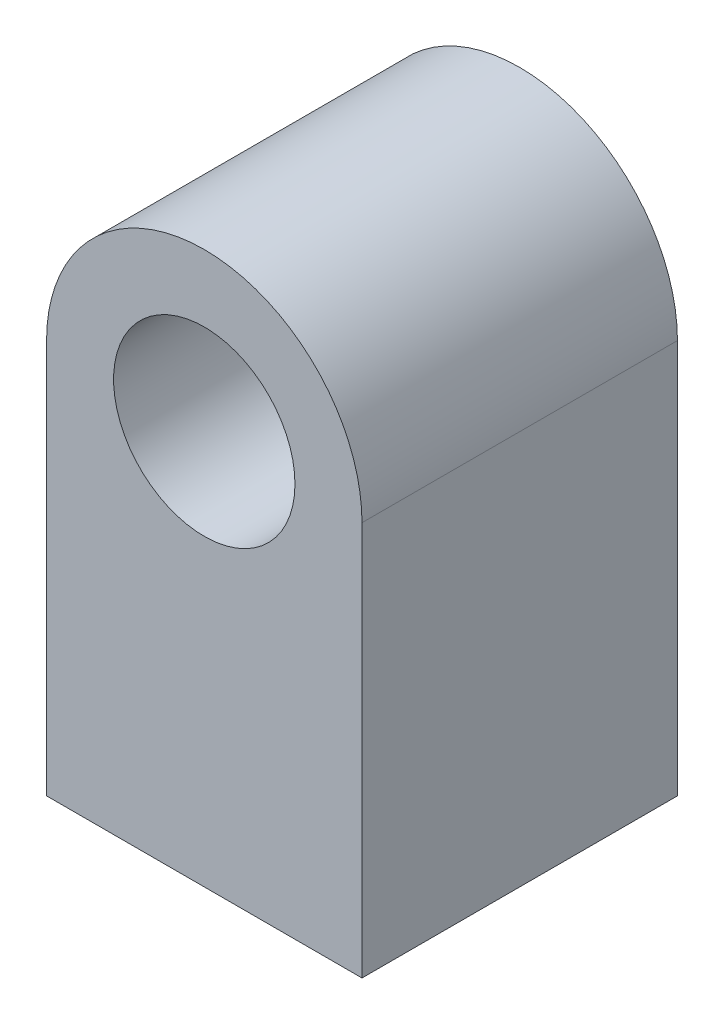
ISO-10303-21;
HEADER;
FILE_DESCRIPTION(('STEP AP214'),'2;1');
FILE_NAME('part.step','',(''),(''),'','','');
FILE_SCHEMA(('AUTOMOTIVE_DESIGN { 1 0 10303 214 1 1 1 1 }'));
ENDSEC;
DATA;
#1=APPLICATION_CONTEXT('core data for automotive mechanical design processes');
#2=APPLICATION_PROTOCOL_DEFINITION('international standard','automotive_design',2000,#1);
#3=PRODUCT_CONTEXT('',#1,'mechanical');
#4=PRODUCT('Part','Part','',(#3));
#5=PRODUCT_RELATED_PRODUCT_CATEGORY('part','',(#4));
#6=PRODUCT_DEFINITION_FORMATION('','',#4);
#7=PRODUCT_DEFINITION_CONTEXT('part definition',#1,'design');
#8=PRODUCT_DEFINITION('design','',#6,#7);
#9=PRODUCT_DEFINITION_SHAPE('','',#8);
#10=(LENGTH_UNIT() NAMED_UNIT(*) SI_UNIT(.MILLI.,.METRE.));
#11=(NAMED_UNIT(*) PLANE_ANGLE_UNIT() SI_UNIT($,.RADIAN.));
#12=(NAMED_UNIT(*) SI_UNIT($,.STERADIAN.) SOLID_ANGLE_UNIT());
#13=UNCERTAINTY_MEASURE_WITH_UNIT(LENGTH_MEASURE(1.E-05),#10,'distance_accuracy_value','');
#14=(GEOMETRIC_REPRESENTATION_CONTEXT(3) GLOBAL_UNCERTAINTY_ASSIGNED_CONTEXT((#13)) GLOBAL_UNIT_ASSIGNED_CONTEXT((#10,
#11,#12)) REPRESENTATION_CONTEXT('',''));
#15=CARTESIAN_POINT('',(0.,0.,0.));
#16=DIRECTION('',(0.,0.,1.));
#17=DIRECTION('',(1.,0.,0.));
#18=AXIS2_PLACEMENT_3D('',#15,#16,#17);
#19=CARTESIAN_POINT('',(0.,0.,4.));
#20=DIRECTION('',(0.,0.,1.));
#21=DIRECTION('',(1.,0.,0.));
#22=AXIS2_PLACEMENT_3D('',#19,#20,#21);
#23=PLANE('',#22);
#24=CARTESIAN_POINT('',(0.,0.,4.));
#25=DIRECTION('',(0.,0.,1.));
#26=DIRECTION('',(1.,0.,0.));
#27=AXIS2_PLACEMENT_3D('',#24,#25,#26);
#28=CIRCLE('',#27,2.);
#29=CARTESIAN_POINT('',(2.,0.,4.));
#30=VERTEX_POINT('',#29);
#31=CARTESIAN_POINT('',(-2.,0.,4.));
#32=VERTEX_POINT('',#31);
#33=EDGE_CURVE('E93',#30,#32,#28,.T.);
#34=ORIENTED_EDGE('',*,*,#33,.T.);
#35=DIRECTION('',(0.,-1.,0.));
#36=VECTOR('',#35,1.);
#37=CARTESIAN_POINT('',(-2.,-5.,4.));
#38=LINE('',#37,#36);
#39=CARTESIAN_POINT('',(-2.,-5.,4.));
#40=VERTEX_POINT('',#39);
#41=EDGE_CURVE('E88',#32,#40,#38,.T.);
#42=ORIENTED_EDGE('',*,*,#41,.T.);
#43=DIRECTION('',(1.,0.,0.));
#44=VECTOR('',#43,1.);
#45=CARTESIAN_POINT('',(2.,-5.,4.));
#46=LINE('',#45,#44);
#47=CARTESIAN_POINT('',(2.,-5.,4.));
#48=VERTEX_POINT('',#47);
#49=EDGE_CURVE('E91',#40,#48,#46,.T.);
#50=ORIENTED_EDGE('',*,*,#49,.T.);
#51=DIRECTION('',(0.,1.,0.));
#52=VECTOR('',#51,1.);
#53=CARTESIAN_POINT('',(2.,0.,4.));
#54=LINE('',#53,#52);
#55=EDGE_CURVE('E58',#48,#30,#54,.T.);
#56=ORIENTED_EDGE('',*,*,#55,.T.);
#57=EDGE_LOOP('',(#34,#42,#50,#56));
#58=FACE_BOUND('',#57,.T.);
#59=CARTESIAN_POINT('',(0.,0.,4.));
#60=DIRECTION('',(0.,0.,1.));
#61=DIRECTION('',(1.,0.,0.));
#62=AXIS2_PLACEMENT_3D('',#59,#60,#61);
#63=CIRCLE('',#62,1.15);
#64=CARTESIAN_POINT('',(1.15,0.,4.));
#65=VERTEX_POINT('',#64);
#66=EDGE_CURVE('E108',#65,#65,#63,.T.);
#67=ORIENTED_EDGE('',*,*,#66,.F.);
#68=EDGE_LOOP('',(#67));
#69=FACE_BOUND('',#68,.T.);
#70=ADVANCED_FACE('F41',(#58,#69),#23,.T.);
#71=CARTESIAN_POINT('',(0.,0.,0.));
#72=DIRECTION('',(0.,0.,1.));
#73=DIRECTION('',(1.,0.,0.));
#74=AXIS2_PLACEMENT_3D('',#71,#72,#73);
#75=PLANE('',#74);
#76=CARTESIAN_POINT('',(0.,0.,0.));
#77=DIRECTION('',(0.,0.,1.));
#78=DIRECTION('',(1.,0.,0.));
#79=AXIS2_PLACEMENT_3D('',#76,#77,#78);
#80=CIRCLE('',#79,2.);
#81=CARTESIAN_POINT('',(2.,0.,0.));
#82=VERTEX_POINT('',#81);
#83=CARTESIAN_POINT('',(-2.,0.,0.));
#84=VERTEX_POINT('',#83);
#85=EDGE_CURVE('E105',#82,#84,#80,.T.);
#86=ORIENTED_EDGE('',*,*,#85,.F.);
#87=DIRECTION('',(0.,1.,0.));
#88=VECTOR('',#87,1.);
#89=CARTESIAN_POINT('',(2.,0.,0.));
#90=LINE('',#89,#88);
#91=CARTESIAN_POINT('',(2.,-5.,0.));
#92=VERTEX_POINT('',#91);
#93=EDGE_CURVE('E81',#92,#82,#90,.T.);
#94=ORIENTED_EDGE('',*,*,#93,.F.);
#95=DIRECTION('',(1.,0.,0.));
#96=VECTOR('',#95,1.);
#97=CARTESIAN_POINT('',(2.,-5.,0.));
#98=LINE('',#97,#96);
#99=CARTESIAN_POINT('',(-2.,-5.,0.));
#100=VERTEX_POINT('',#99);
#101=EDGE_CURVE('E75',#100,#92,#98,.T.);
#102=ORIENTED_EDGE('',*,*,#101,.F.);
#103=DIRECTION('',(0.,-1.,0.));
#104=VECTOR('',#103,1.);
#105=CARTESIAN_POINT('',(-2.,-5.,0.));
#106=LINE('',#105,#104);
#107=EDGE_CURVE('E97',#84,#100,#106,.T.);
#108=ORIENTED_EDGE('',*,*,#107,.F.);
#109=EDGE_LOOP('',(#86,#94,#102,#108));
#110=FACE_BOUND('',#109,.T.);
#111=CARTESIAN_POINT('',(0.,0.,0.));
#112=DIRECTION('',(0.,0.,1.));
#113=DIRECTION('',(1.,0.,0.));
#114=AXIS2_PLACEMENT_3D('',#111,#112,#113);
#115=CIRCLE('',#114,1.15);
#116=CARTESIAN_POINT('',(1.15,0.,0.));
#117=VERTEX_POINT('',#116);
#118=EDGE_CURVE('E120',#117,#117,#115,.T.);
#119=ORIENTED_EDGE('',*,*,#118,.T.);
#120=EDGE_LOOP('',(#119));
#121=FACE_BOUND('',#120,.T.);
#122=ADVANCED_FACE('F116',(#110,#121),#75,.F.);
#123=CARTESIAN_POINT('',(0.,0.,4.));
#124=DIRECTION('',(0.,0.,-1.));
#125=DIRECTION('',(-1.,0.,0.));
#126=AXIS2_PLACEMENT_3D('',#123,#124,#125);
#127=CYLINDRICAL_SURFACE('',#126,2.);
#128=ORIENTED_EDGE('',*,*,#85,.T.);
#129=DIRECTION('',(0.,0.,-1.));
#130=VECTOR('',#129,1.);
#131=CARTESIAN_POINT('',(-2.,0.,4.));
#132=LINE('',#131,#130);
#133=EDGE_CURVE('E11',#32,#84,#132,.T.);
#134=ORIENTED_EDGE('',*,*,#133,.F.);
#135=ORIENTED_EDGE('',*,*,#33,.F.);
#136=DIRECTION('',(0.,0.,-1.));
#137=VECTOR('',#136,1.);
#138=CARTESIAN_POINT('',(2.,0.,4.));
#139=LINE('',#138,#137);
#140=EDGE_CURVE('E101',#30,#82,#139,.T.);
#141=ORIENTED_EDGE('',*,*,#140,.T.);
#142=EDGE_LOOP('',(#128,#134,#135,#141));
#143=FACE_BOUND('',#142,.T.);
#144=ADVANCED_FACE('F43',(#143),#127,.T.);
#145=CARTESIAN_POINT('',(-2.,-5.,4.));
#146=DIRECTION('',(1.,0.,0.));
#147=DIRECTION('',(0.,1.,0.));
#148=AXIS2_PLACEMENT_3D('',#145,#146,#147);
#149=PLANE('',#148);
#150=ORIENTED_EDGE('',*,*,#107,.T.);
#151=DIRECTION('',(0.,0.,-1.));
#152=VECTOR('',#151,1.);
#153=CARTESIAN_POINT('',(-2.,-5.,4.));
#154=LINE('',#153,#152);
#155=EDGE_CURVE('E50',#40,#100,#154,.T.);
#156=ORIENTED_EDGE('',*,*,#155,.F.);
#157=ORIENTED_EDGE('',*,*,#41,.F.);
#158=ORIENTED_EDGE('',*,*,#133,.T.);
#159=EDGE_LOOP('',(#150,#156,#157,#158));
#160=FACE_BOUND('',#159,.T.);
#161=ADVANCED_FACE('F96',(#160),#149,.F.);
#162=CARTESIAN_POINT('',(2.,-5.,4.));
#163=DIRECTION('',(0.,1.,0.));
#164=DIRECTION('',(0.,0.,1.));
#165=AXIS2_PLACEMENT_3D('',#162,#163,#164);
#166=PLANE('',#165);
#167=CARTESIAN_POINT('',(0.,-5.,2.));
#168=DIRECTION('',(0.,-1.,0.));
#169=DIRECTION('',(0.,0.,-1.));
#170=AXIS2_PLACEMENT_3D('',#167,#168,#169);
#171=CIRCLE('',#170,1.);
#172=CARTESIAN_POINT('',(0.,-5.,1.));
#173=VERTEX_POINT('',#172);
#174=EDGE_CURVE('E126',#173,#173,#171,.T.);
#175=ORIENTED_EDGE('',*,*,#174,.F.);
#176=EDGE_LOOP('',(#175));
#177=FACE_BOUND('',#176,.T.);
#178=ORIENTED_EDGE('',*,*,#101,.T.);
#179=DIRECTION('',(0.,0.,-1.));
#180=VECTOR('',#179,1.);
#181=CARTESIAN_POINT('',(2.,-5.,4.));
#182=LINE('',#181,#180);
#183=EDGE_CURVE('E98',#48,#92,#182,.T.);
#184=ORIENTED_EDGE('',*,*,#183,.F.);
#185=ORIENTED_EDGE('',*,*,#49,.F.);
#186=ORIENTED_EDGE('',*,*,#155,.T.);
#187=EDGE_LOOP('',(#178,#184,#185,#186));
#188=FACE_BOUND('',#187,.T.);
#189=ADVANCED_FACE('F99',(#177,#188),#166,.F.);
#190=CARTESIAN_POINT('',(2.,0.,4.));
#191=DIRECTION('',(-1.,0.,0.));
#192=DIRECTION('',(0.,-1.,0.));
#193=AXIS2_PLACEMENT_3D('',#190,#191,#192);
#194=PLANE('',#193);
#195=ORIENTED_EDGE('',*,*,#93,.T.);
#196=ORIENTED_EDGE('',*,*,#140,.F.);
#197=ORIENTED_EDGE('',*,*,#55,.F.);
#198=ORIENTED_EDGE('',*,*,#183,.T.);
#199=EDGE_LOOP('',(#195,#196,#197,#198));
#200=FACE_BOUND('',#199,.T.);
#201=ADVANCED_FACE('F113',(#200),#194,.F.);
#202=CARTESIAN_POINT('',(0.,0.,4.));
#203=DIRECTION('',(0.,0.,-1.));
#204=DIRECTION('',(-1.,0.,0.));
#205=AXIS2_PLACEMENT_3D('',#202,#203,#204);
#206=CYLINDRICAL_SURFACE('',#205,1.15);
#207=ORIENTED_EDGE('',*,*,#66,.T.);
#208=EDGE_LOOP('',(#207));
#209=FACE_BOUND('',#208,.T.);
#210=ORIENTED_EDGE('',*,*,#118,.F.);
#211=EDGE_LOOP('',(#210));
#212=FACE_BOUND('',#211,.T.);
#213=ADVANCED_FACE('F137',(#209,#212),#206,.F.);
#214=CARTESIAN_POINT('',(0.,-1.5,2.));
#215=DIRECTION('',(0.,-1.,0.));
#216=DIRECTION('',(0.,0.,-1.));
#217=AXIS2_PLACEMENT_3D('',#214,#215,#216);
#218=CYLINDRICAL_SURFACE('',#217,1.);
#219=CARTESIAN_POINT('',(0.,-1.5,2.));
#220=DIRECTION('',(0.,-1.,0.));
#221=DIRECTION('',(0.,0.,-1.));
#222=AXIS2_PLACEMENT_3D('',#219,#220,#221);
#223=CIRCLE('',#222,1.);
#224=CARTESIAN_POINT('',(0.,-1.5,1.));
#225=VERTEX_POINT('',#224);
#226=EDGE_CURVE('E123',#225,#225,#223,.T.);
#227=ORIENTED_EDGE('',*,*,#226,.F.);
#228=EDGE_LOOP('',(#227));
#229=FACE_BOUND('',#228,.T.);
#230=ORIENTED_EDGE('',*,*,#174,.T.);
#231=EDGE_LOOP('',(#230));
#232=FACE_BOUND('',#231,.T.);
#233=ADVANCED_FACE('F134',(#229,#232),#218,.F.);
#234=CARTESIAN_POINT('',(0.,-1.5,2.));
#235=DIRECTION('',(0.,-1.,0.));
#236=DIRECTION('',(0.,0.,-1.));
#237=AXIS2_PLACEMENT_3D('',#234,#235,#236);
#238=PLANE('',#237);
#239=ORIENTED_EDGE('',*,*,#226,.T.);
#240=EDGE_LOOP('',(#239));
#241=FACE_BOUND('',#240,.T.);
#242=ADVANCED_FACE('F132',(#241),#238,.T.);
#243=CLOSED_SHELL('',(#70,#122,#144,#161,#189,#201,#213,#233,#242));
#244=MANIFOLD_SOLID_BREP('B2',#243);
#245=ADVANCED_BREP_SHAPE_REPRESENTATION('',(#18,#244),#14);
#246=SHAPE_DEFINITION_REPRESENTATION(#9,#245);
ENDSEC;
END-ISO-10303-21;
